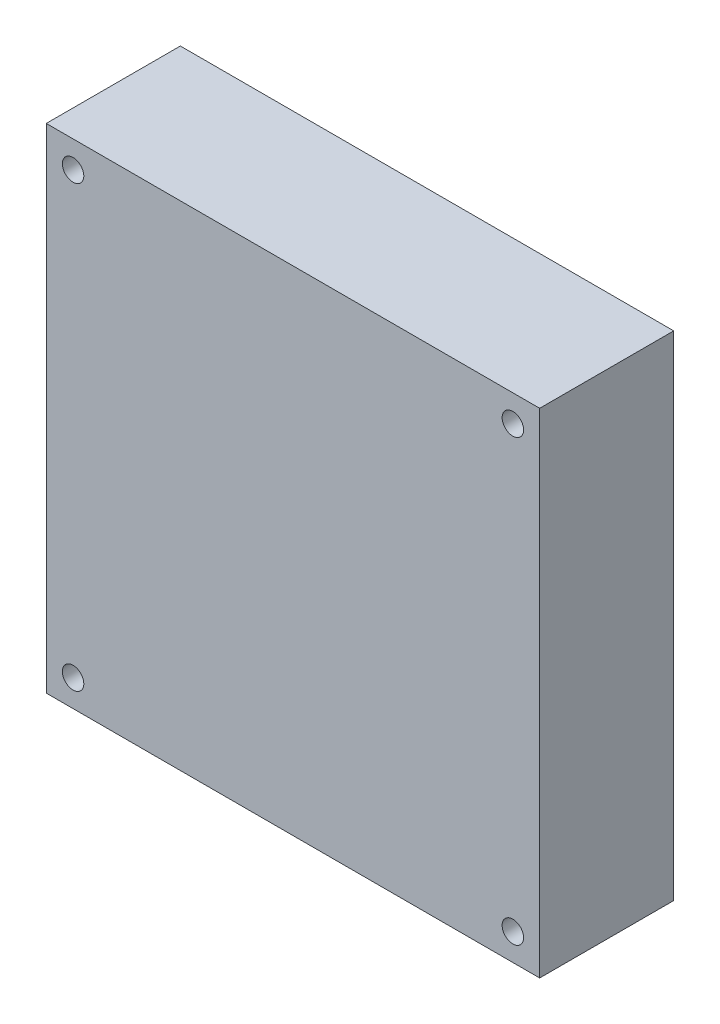
ISO-10303-21;
HEADER;
FILE_DESCRIPTION(('STEP AP214'),'2;1');
FILE_NAME('part.step','',(''),(''),'','','');
FILE_SCHEMA(('AUTOMOTIVE_DESIGN { 1 0 10303 214 1 1 1 1 }'));
ENDSEC;
DATA;
#1=APPLICATION_CONTEXT('core data for automotive mechanical design processes');
#2=APPLICATION_PROTOCOL_DEFINITION('international standard','automotive_design',2000,#1);
#3=PRODUCT_CONTEXT('',#1,'mechanical');
#4=PRODUCT('Part','Part','',(#3));
#5=PRODUCT_RELATED_PRODUCT_CATEGORY('part','',(#4));
#6=PRODUCT_DEFINITION_FORMATION('','',#4);
#7=PRODUCT_DEFINITION_CONTEXT('part definition',#1,'design');
#8=PRODUCT_DEFINITION('design','',#6,#7);
#9=PRODUCT_DEFINITION_SHAPE('','',#8);
#10=(LENGTH_UNIT() NAMED_UNIT(*) SI_UNIT(.MILLI.,.METRE.));
#11=(NAMED_UNIT(*) PLANE_ANGLE_UNIT() SI_UNIT($,.RADIAN.));
#12=(NAMED_UNIT(*) SI_UNIT($,.STERADIAN.) SOLID_ANGLE_UNIT());
#13=UNCERTAINTY_MEASURE_WITH_UNIT(LENGTH_MEASURE(1.E-05),#10,'distance_accuracy_value','');
#14=(GEOMETRIC_REPRESENTATION_CONTEXT(3) GLOBAL_UNCERTAINTY_ASSIGNED_CONTEXT((#13)) GLOBAL_UNIT_ASSIGNED_CONTEXT((#10,
#11,#12)) REPRESENTATION_CONTEXT('',''));
#15=CARTESIAN_POINT('',(0.,0.,0.));
#16=DIRECTION('',(0.,0.,1.));
#17=DIRECTION('',(1.,0.,0.));
#18=AXIS2_PLACEMENT_3D('',#15,#16,#17);
#19=CARTESIAN_POINT('',(0.,0.,25.));
#20=DIRECTION('',(0.,0.,-1.));
#21=DIRECTION('',(-1.,0.,0.));
#22=AXIS2_PLACEMENT_3D('',#19,#20,#21);
#23=PLANE('',#22);
#24=DIRECTION('',(0.,-1.,0.));
#25=VECTOR('',#24,1.);
#26=CARTESIAN_POINT('',(0.,0.,25.));
#27=LINE('',#26,#25);
#28=CARTESIAN_POINT('',(0.,92.,25.));
#29=VERTEX_POINT('',#28);
#30=CARTESIAN_POINT('',(0.,0.,25.));
#31=VERTEX_POINT('',#30);
#32=EDGE_CURVE('E87',#29,#31,#27,.T.);
#33=ORIENTED_EDGE('',*,*,#32,.T.);
#34=DIRECTION('',(1.,0.,0.));
#35=VECTOR('',#34,1.);
#36=CARTESIAN_POINT('',(0.,0.,25.));
#37=LINE('',#36,#35);
#38=CARTESIAN_POINT('',(92.,0.,25.));
#39=VERTEX_POINT('',#38);
#40=EDGE_CURVE('E82',#31,#39,#37,.T.);
#41=ORIENTED_EDGE('',*,*,#40,.T.);
#42=DIRECTION('',(0.,1.,0.));
#43=VECTOR('',#42,1.);
#44=CARTESIAN_POINT('',(92.,0.,25.));
#45=LINE('',#44,#43);
#46=CARTESIAN_POINT('',(92.,92.,25.));
#47=VERTEX_POINT('',#46);
#48=EDGE_CURVE('E85',#39,#47,#45,.T.);
#49=ORIENTED_EDGE('',*,*,#48,.T.);
#50=DIRECTION('',(-1.,0.,0.));
#51=VECTOR('',#50,1.);
#52=CARTESIAN_POINT('',(0.,92.,25.));
#53=LINE('',#52,#51);
#54=EDGE_CURVE('E52',#47,#29,#53,.T.);
#55=ORIENTED_EDGE('',*,*,#54,.T.);
#56=EDGE_LOOP('',(#33,#41,#49,#55));
#57=FACE_BOUND('',#56,.T.);
#58=CARTESIAN_POINT('',(4.99999999999998,87.,25.));
#59=DIRECTION('',(0.,0.,1.));
#60=DIRECTION('',(1.,0.,0.));
#61=AXIS2_PLACEMENT_3D('',#58,#59,#60);
#62=CIRCLE('',#61,2.);
#63=CARTESIAN_POINT('',(6.99999999999998,87.,25.));
#64=VERTEX_POINT('',#63);
#65=EDGE_CURVE('E102',#64,#64,#62,.T.);
#66=ORIENTED_EDGE('',*,*,#65,.F.);
#67=EDGE_LOOP('',(#66));
#68=FACE_BOUND('',#67,.T.);
#69=CARTESIAN_POINT('',(87.,87.,25.));
#70=DIRECTION('',(0.,0.,1.));
#71=DIRECTION('',(1.,0.,0.));
#72=AXIS2_PLACEMENT_3D('',#69,#70,#71);
#73=CIRCLE('',#72,2.);
#74=CARTESIAN_POINT('',(89.,87.,25.));
#75=VERTEX_POINT('',#74);
#76=EDGE_CURVE('E117',#75,#75,#73,.T.);
#77=ORIENTED_EDGE('',*,*,#76,.F.);
#78=EDGE_LOOP('',(#77));
#79=FACE_BOUND('',#78,.T.);
#80=CARTESIAN_POINT('',(87.,4.99999999999996,25.));
#81=DIRECTION('',(0.,0.,1.));
#82=DIRECTION('',(1.,0.,0.));
#83=AXIS2_PLACEMENT_3D('',#80,#81,#82);
#84=CIRCLE('',#83,2.);
#85=CARTESIAN_POINT('',(89.,4.99999999999996,25.));
#86=VERTEX_POINT('',#85);
#87=EDGE_CURVE('E123',#86,#86,#84,.T.);
#88=ORIENTED_EDGE('',*,*,#87,.F.);
#89=EDGE_LOOP('',(#88));
#90=FACE_BOUND('',#89,.T.);
#91=CARTESIAN_POINT('',(4.99999999999998,5.,25.));
#92=DIRECTION('',(0.,0.,1.));
#93=DIRECTION('',(1.,0.,0.));
#94=AXIS2_PLACEMENT_3D('',#91,#92,#93);
#95=CIRCLE('',#94,2.);
#96=CARTESIAN_POINT('',(6.99999999999998,5.,25.));
#97=VERTEX_POINT('',#96);
#98=EDGE_CURVE('E129',#97,#97,#95,.T.);
#99=ORIENTED_EDGE('',*,*,#98,.F.);
#100=EDGE_LOOP('',(#99));
#101=FACE_BOUND('',#100,.T.);
#102=ADVANCED_FACE('F35',(#57,#68,#79,#90,#101),#23,.F.);
#103=CARTESIAN_POINT('',(0.,0.,0.));
#104=DIRECTION('',(0.,0.,-1.));
#105=DIRECTION('',(-1.,0.,0.));
#106=AXIS2_PLACEMENT_3D('',#103,#104,#105);
#107=PLANE('',#106);
#108=CARTESIAN_POINT('',(87.,4.99999999999996,0.));
#109=DIRECTION('',(0.,0.,1.));
#110=DIRECTION('',(1.,0.,0.));
#111=AXIS2_PLACEMENT_3D('',#108,#109,#110);
#112=CIRCLE('',#111,2.);
#113=CARTESIAN_POINT('',(89.,4.99999999999996,0.));
#114=VERTEX_POINT('',#113);
#115=EDGE_CURVE('E126',#114,#114,#112,.T.);
#116=ORIENTED_EDGE('',*,*,#115,.T.);
#117=EDGE_LOOP('',(#116));
#118=FACE_BOUND('',#117,.T.);
#119=CARTESIAN_POINT('',(4.99999999999998,87.,0.));
#120=DIRECTION('',(0.,0.,1.));
#121=DIRECTION('',(1.,0.,0.));
#122=AXIS2_PLACEMENT_3D('',#119,#120,#121);
#123=CIRCLE('',#122,2.);
#124=CARTESIAN_POINT('',(6.99999999999998,87.,0.));
#125=VERTEX_POINT('',#124);
#126=EDGE_CURVE('E114',#125,#125,#123,.T.);
#127=ORIENTED_EDGE('',*,*,#126,.T.);
#128=EDGE_LOOP('',(#127));
#129=FACE_BOUND('',#128,.T.);
#130=DIRECTION('',(0.,-1.,0.));
#131=VECTOR('',#130,1.);
#132=CARTESIAN_POINT('',(0.,0.,0.));
#133=LINE('',#132,#131);
#134=CARTESIAN_POINT('',(0.,92.,0.));
#135=VERTEX_POINT('',#134);
#136=CARTESIAN_POINT('',(0.,0.,0.));
#137=VERTEX_POINT('',#136);
#138=EDGE_CURVE('E99',#135,#137,#133,.T.);
#139=ORIENTED_EDGE('',*,*,#138,.F.);
#140=DIRECTION('',(-1.,0.,0.));
#141=VECTOR('',#140,1.);
#142=CARTESIAN_POINT('',(0.,92.,0.));
#143=LINE('',#142,#141);
#144=CARTESIAN_POINT('',(92.,92.,0.));
#145=VERTEX_POINT('',#144);
#146=EDGE_CURVE('E75',#145,#135,#143,.T.);
#147=ORIENTED_EDGE('',*,*,#146,.F.);
#148=DIRECTION('',(0.,1.,0.));
#149=VECTOR('',#148,1.);
#150=CARTESIAN_POINT('',(92.,0.,0.));
#151=LINE('',#150,#149);
#152=CARTESIAN_POINT('',(92.,0.,0.));
#153=VERTEX_POINT('',#152);
#154=EDGE_CURVE('E69',#153,#145,#151,.T.);
#155=ORIENTED_EDGE('',*,*,#154,.F.);
#156=DIRECTION('',(1.,0.,0.));
#157=VECTOR('',#156,1.);
#158=CARTESIAN_POINT('',(0.,0.,0.));
#159=LINE('',#158,#157);
#160=EDGE_CURVE('E91',#137,#153,#159,.T.);
#161=ORIENTED_EDGE('',*,*,#160,.F.);
#162=EDGE_LOOP('',(#139,#147,#155,#161));
#163=FACE_BOUND('',#162,.T.);
#164=CARTESIAN_POINT('',(87.,87.,0.));
#165=DIRECTION('',(0.,0.,1.));
#166=DIRECTION('',(1.,0.,0.));
#167=AXIS2_PLACEMENT_3D('',#164,#165,#166);
#168=CIRCLE('',#167,2.);
#169=CARTESIAN_POINT('',(89.,87.,0.));
#170=VERTEX_POINT('',#169);
#171=EDGE_CURVE('E120',#170,#170,#168,.T.);
#172=ORIENTED_EDGE('',*,*,#171,.T.);
#173=EDGE_LOOP('',(#172));
#174=FACE_BOUND('',#173,.T.);
#175=CARTESIAN_POINT('',(4.99999999999998,5.,0.));
#176=DIRECTION('',(0.,0.,1.));
#177=DIRECTION('',(1.,0.,0.));
#178=AXIS2_PLACEMENT_3D('',#175,#176,#177);
#179=CIRCLE('',#178,2.);
#180=CARTESIAN_POINT('',(6.99999999999998,5.,0.));
#181=VERTEX_POINT('',#180);
#182=EDGE_CURVE('E132',#181,#181,#179,.T.);
#183=ORIENTED_EDGE('',*,*,#182,.T.);
#184=EDGE_LOOP('',(#183));
#185=FACE_BOUND('',#184,.T.);
#186=ADVANCED_FACE('F110',(#118,#129,#163,#174,#185),#107,.T.);
#187=CARTESIAN_POINT('',(0.,0.,25.));
#188=DIRECTION('',(1.,0.,0.));
#189=DIRECTION('',(0.,0.,-1.));
#190=AXIS2_PLACEMENT_3D('',#187,#188,#189);
#191=PLANE('',#190);
#192=ORIENTED_EDGE('',*,*,#138,.T.);
#193=DIRECTION('',(0.,0.,-1.));
#194=VECTOR('',#193,1.);
#195=CARTESIAN_POINT('',(0.,0.,25.));
#196=LINE('',#195,#194);
#197=EDGE_CURVE('E11',#31,#137,#196,.T.);
#198=ORIENTED_EDGE('',*,*,#197,.F.);
#199=ORIENTED_EDGE('',*,*,#32,.F.);
#200=DIRECTION('',(0.,0.,-1.));
#201=VECTOR('',#200,1.);
#202=CARTESIAN_POINT('',(0.,92.,25.));
#203=LINE('',#202,#201);
#204=EDGE_CURVE('E95',#29,#135,#203,.T.);
#205=ORIENTED_EDGE('',*,*,#204,.T.);
#206=EDGE_LOOP('',(#192,#198,#199,#205));
#207=FACE_BOUND('',#206,.T.);
#208=ADVANCED_FACE('F37',(#207),#191,.F.);
#209=CARTESIAN_POINT('',(0.,0.,25.));
#210=DIRECTION('',(0.,1.,0.));
#211=DIRECTION('',(0.,0.,1.));
#212=AXIS2_PLACEMENT_3D('',#209,#210,#211);
#213=PLANE('',#212);
#214=ORIENTED_EDGE('',*,*,#160,.T.);
#215=DIRECTION('',(0.,0.,-1.));
#216=VECTOR('',#215,1.);
#217=CARTESIAN_POINT('',(92.,0.,25.));
#218=LINE('',#217,#216);
#219=EDGE_CURVE('E44',#39,#153,#218,.T.);
#220=ORIENTED_EDGE('',*,*,#219,.F.);
#221=ORIENTED_EDGE('',*,*,#40,.F.);
#222=ORIENTED_EDGE('',*,*,#197,.T.);
#223=EDGE_LOOP('',(#214,#220,#221,#222));
#224=FACE_BOUND('',#223,.T.);
#225=ADVANCED_FACE('F90',(#224),#213,.F.);
#226=CARTESIAN_POINT('',(92.,0.,25.));
#227=DIRECTION('',(-1.,0.,0.));
#228=DIRECTION('',(0.,0.,1.));
#229=AXIS2_PLACEMENT_3D('',#226,#227,#228);
#230=PLANE('',#229);
#231=ORIENTED_EDGE('',*,*,#154,.T.);
#232=DIRECTION('',(0.,0.,-1.));
#233=VECTOR('',#232,1.);
#234=CARTESIAN_POINT('',(92.,92.,25.));
#235=LINE('',#234,#233);
#236=EDGE_CURVE('E92',#47,#145,#235,.T.);
#237=ORIENTED_EDGE('',*,*,#236,.F.);
#238=ORIENTED_EDGE('',*,*,#48,.F.);
#239=ORIENTED_EDGE('',*,*,#219,.T.);
#240=EDGE_LOOP('',(#231,#237,#238,#239));
#241=FACE_BOUND('',#240,.T.);
#242=ADVANCED_FACE('F93',(#241),#230,.F.);
#243=CARTESIAN_POINT('',(0.,92.,25.));
#244=DIRECTION('',(0.,-1.,0.));
#245=DIRECTION('',(0.,0.,-1.));
#246=AXIS2_PLACEMENT_3D('',#243,#244,#245);
#247=PLANE('',#246);
#248=ORIENTED_EDGE('',*,*,#146,.T.);
#249=ORIENTED_EDGE('',*,*,#204,.F.);
#250=ORIENTED_EDGE('',*,*,#54,.F.);
#251=ORIENTED_EDGE('',*,*,#236,.T.);
#252=EDGE_LOOP('',(#248,#249,#250,#251));
#253=FACE_BOUND('',#252,.T.);
#254=ADVANCED_FACE('F107',(#253),#247,.F.);
#255=CARTESIAN_POINT('',(4.99999999999998,87.,25.));
#256=DIRECTION('',(0.,0.,-1.));
#257=DIRECTION('',(-1.,0.,0.));
#258=AXIS2_PLACEMENT_3D('',#255,#256,#257);
#259=CYLINDRICAL_SURFACE('',#258,2.);
#260=ORIENTED_EDGE('',*,*,#65,.T.);
#261=EDGE_LOOP('',(#260));
#262=FACE_BOUND('',#261,.T.);
#263=ORIENTED_EDGE('',*,*,#126,.F.);
#264=EDGE_LOOP('',(#263));
#265=FACE_BOUND('',#264,.T.);
#266=ADVANCED_FACE('F149',(#262,#265),#259,.F.);
#267=CARTESIAN_POINT('',(87.,87.,25.));
#268=DIRECTION('',(0.,0.,-1.));
#269=DIRECTION('',(-1.,0.,0.));
#270=AXIS2_PLACEMENT_3D('',#267,#268,#269);
#271=CYLINDRICAL_SURFACE('',#270,2.);
#272=ORIENTED_EDGE('',*,*,#76,.T.);
#273=EDGE_LOOP('',(#272));
#274=FACE_BOUND('',#273,.T.);
#275=ORIENTED_EDGE('',*,*,#171,.F.);
#276=EDGE_LOOP('',(#275));
#277=FACE_BOUND('',#276,.T.);
#278=ADVANCED_FACE('F195',(#274,#277),#271,.F.);
#279=CARTESIAN_POINT('',(87.,4.99999999999996,25.));
#280=DIRECTION('',(0.,0.,-1.));
#281=DIRECTION('',(-1.,0.,0.));
#282=AXIS2_PLACEMENT_3D('',#279,#280,#281);
#283=CYLINDRICAL_SURFACE('',#282,2.);
#284=ORIENTED_EDGE('',*,*,#87,.T.);
#285=EDGE_LOOP('',(#284));
#286=FACE_BOUND('',#285,.T.);
#287=ORIENTED_EDGE('',*,*,#115,.F.);
#288=EDGE_LOOP('',(#287));
#289=FACE_BOUND('',#288,.T.);
#290=ADVANCED_FACE('F203',(#286,#289),#283,.F.);
#291=CARTESIAN_POINT('',(4.99999999999998,5.,25.));
#292=DIRECTION('',(0.,0.,-1.));
#293=DIRECTION('',(-1.,0.,0.));
#294=AXIS2_PLACEMENT_3D('',#291,#292,#293);
#295=CYLINDRICAL_SURFACE('',#294,2.);
#296=ORIENTED_EDGE('',*,*,#98,.T.);
#297=EDGE_LOOP('',(#296));
#298=FACE_BOUND('',#297,.T.);
#299=ORIENTED_EDGE('',*,*,#182,.F.);
#300=EDGE_LOOP('',(#299));
#301=FACE_BOUND('',#300,.T.);
#302=ADVANCED_FACE('F138',(#298,#301),#295,.F.);
#303=CLOSED_SHELL('',(#102,#186,#208,#225,#242,#254,#266,#278,#290,#302));
#304=MANIFOLD_SOLID_BREP('B2',#303);
#305=ADVANCED_BREP_SHAPE_REPRESENTATION('',(#18,#304),#14);
#306=SHAPE_DEFINITION_REPRESENTATION(#9,#305);
ENDSEC;
END-ISO-10303-21;
